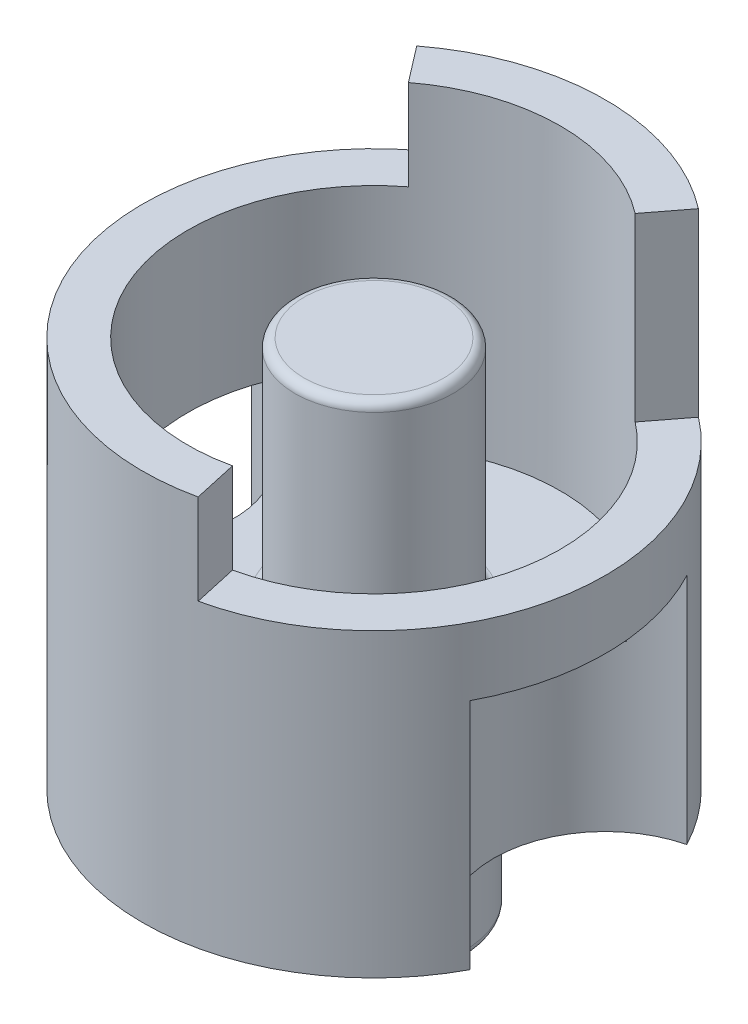
ISO-10303-21;
HEADER;
FILE_DESCRIPTION(('STEP AP214'),'2;1');
FILE_NAME('part.step','',(''),(''),'','','');
FILE_SCHEMA(('AUTOMOTIVE_DESIGN { 1 0 10303 214 1 1 1 1 }'));
ENDSEC;
DATA;
#1=APPLICATION_CONTEXT('core data for automotive mechanical design processes');
#2=APPLICATION_PROTOCOL_DEFINITION('international standard','automotive_design',2000,#1);
#3=PRODUCT_CONTEXT('',#1,'mechanical');
#4=PRODUCT('Part','Part','',(#3));
#5=PRODUCT_RELATED_PRODUCT_CATEGORY('part','',(#4));
#6=PRODUCT_DEFINITION_FORMATION('','',#4);
#7=PRODUCT_DEFINITION_CONTEXT('part definition',#1,'design');
#8=PRODUCT_DEFINITION('design','',#6,#7);
#9=PRODUCT_DEFINITION_SHAPE('','',#8);
#10=(LENGTH_UNIT() NAMED_UNIT(*) SI_UNIT(.MILLI.,.METRE.));
#11=(NAMED_UNIT(*) PLANE_ANGLE_UNIT() SI_UNIT($,.RADIAN.));
#12=(NAMED_UNIT(*) SI_UNIT($,.STERADIAN.) SOLID_ANGLE_UNIT());
#13=UNCERTAINTY_MEASURE_WITH_UNIT(LENGTH_MEASURE(1.E-05),#10,'distance_accuracy_value','');
#14=(GEOMETRIC_REPRESENTATION_CONTEXT(3) GLOBAL_UNCERTAINTY_ASSIGNED_CONTEXT((#13)) GLOBAL_UNIT_ASSIGNED_CONTEXT((#10,
#11,#12)) REPRESENTATION_CONTEXT('',''));
#15=CARTESIAN_POINT('',(0.,0.,0.));
#16=DIRECTION('',(0.,0.,1.));
#17=DIRECTION('',(1.,0.,0.));
#18=AXIS2_PLACEMENT_3D('',#15,#16,#17);
#19=CARTESIAN_POINT('',(0.,13.5382,0.));
#20=DIRECTION('',(0.,-1.,0.));
#21=DIRECTION('',(0.,0.,-1.));
#22=AXIS2_PLACEMENT_3D('',#19,#20,#21);
#23=CYLINDRICAL_SURFACE('',#22,6.50875);
#24=CARTESIAN_POINT('',(0.,0.,0.));
#25=DIRECTION('',(0.,1.,0.));
#26=DIRECTION('',(0.,0.,1.));
#27=AXIS2_PLACEMENT_3D('',#24,#25,#26);
#28=CIRCLE('',#27,6.50875);
#29=CARTESIAN_POINT('',(5.75095840382279,0.,-3.048));
#30=VERTEX_POINT('',#29);
#31=CARTESIAN_POINT('',(-5.99268108299615,0.,-2.54));
#32=VERTEX_POINT('',#31);
#33=EDGE_CURVE('E177',#30,#32,#28,.T.);
#34=ORIENTED_EDGE('',*,*,#33,.T.);
#35=DIRECTION('',(0.,-1.,0.));
#36=VECTOR('',#35,1.);
#37=CARTESIAN_POINT('',(-5.99268108299615,15.3157336749619,-2.54));
#38=LINE('',#37,#36);
#39=CARTESIAN_POINT('',(-5.99268108299615,6.5532,-2.54));
#40=VERTEX_POINT('',#39);
#41=EDGE_CURVE('E69',#40,#32,#38,.T.);
#42=ORIENTED_EDGE('',*,*,#41,.F.);
#43=CARTESIAN_POINT('',(0.,6.5532,0.));
#44=DIRECTION('',(0.,-1.,0.));
#45=DIRECTION('',(0.,0.,-1.));
#46=AXIS2_PLACEMENT_3D('',#43,#44,#45);
#47=CIRCLE('',#46,6.50875);
#48=CARTESIAN_POINT('',(-5.99268108299616,6.5532,2.54));
#49=VERTEX_POINT('',#48);
#50=EDGE_CURVE('E171',#40,#49,#47,.F.);
#51=ORIENTED_EDGE('',*,*,#50,.T.);
#52=DIRECTION('',(0.,-1.,0.));
#53=VECTOR('',#52,1.);
#54=CARTESIAN_POINT('',(-5.99268108299616,15.3157336749619,2.54));
#55=LINE('',#54,#53);
#56=CARTESIAN_POINT('',(-5.99268108299616,0.,2.54));
#57=VERTEX_POINT('',#56);
#58=EDGE_CURVE('E156',#49,#57,#55,.T.);
#59=ORIENTED_EDGE('',*,*,#58,.T.);
#60=CARTESIAN_POINT('',(5.75095840382279,0.,3.048));
#61=VERTEX_POINT('',#60);
#62=EDGE_CURVE('E169',#57,#61,#28,.T.);
#63=ORIENTED_EDGE('',*,*,#62,.T.);
#64=DIRECTION('',(0.,-1.,0.));
#65=VECTOR('',#64,1.);
#66=CARTESIAN_POINT('',(5.75095840382279,15.3157336749619,3.048));
#67=LINE('',#66,#65);
#68=CARTESIAN_POINT('',(5.75095840382279,6.5532,3.048));
#69=VERTEX_POINT('',#68);
#70=EDGE_CURVE('E77',#69,#61,#67,.T.);
#71=ORIENTED_EDGE('',*,*,#70,.F.);
#72=CARTESIAN_POINT('',(0.,6.5532,0.));
#73=DIRECTION('',(0.,-1.,0.));
#74=DIRECTION('',(0.,0.,-1.));
#75=AXIS2_PLACEMENT_3D('',#72,#73,#74);
#76=CIRCLE('',#75,6.50875);
#77=CARTESIAN_POINT('',(5.75095840382279,6.5532,-3.048));
#78=VERTEX_POINT('',#77);
#79=EDGE_CURVE('E408',#69,#78,#76,.F.);
#80=ORIENTED_EDGE('',*,*,#79,.T.);
#81=DIRECTION('',(0.,-1.,0.));
#82=VECTOR('',#81,1.);
#83=CARTESIAN_POINT('',(5.75095840382279,15.3157336749619,-3.048));
#84=LINE('',#83,#82);
#85=EDGE_CURVE('E404',#78,#30,#84,.T.);
#86=ORIENTED_EDGE('',*,*,#85,.T.);
#87=EDGE_LOOP('',(#34,#42,#51,#59,#63,#71,#80,#86));
#88=FACE_BOUND('',#87,.T.);
#89=CARTESIAN_POINT('',(0.,8.4582,0.));
#90=DIRECTION('',(0.,1.,0.));
#91=DIRECTION('',(0.,0.,-1.));
#92=AXIS2_PLACEMENT_3D('',#89,#90,#91);
#93=CIRCLE('',#92,6.50875);
#94=CARTESIAN_POINT('',(1.4087513372196,8.4582,6.35446663634187));
#95=VERTEX_POINT('',#94);
#96=CARTESIAN_POINT('',(3.96227595106051,8.4582,-5.16373855362057));
#97=VERTEX_POINT('',#96);
#98=EDGE_CURVE('E310',#95,#97,#93,.T.);
#99=ORIENTED_EDGE('',*,*,#98,.F.);
#100=DIRECTION('',(0.,1.,0.));
#101=VECTOR('',#100,1.);
#102=CARTESIAN_POINT('',(1.4087513372196,8.4582,6.35446663634187));
#103=LINE('',#102,#101);
#104=CARTESIAN_POINT('',(1.4087513372196,10.9982,6.35446663634187));
#105=VERTEX_POINT('',#104);
#106=EDGE_CURVE('E325',#95,#105,#103,.T.);
#107=ORIENTED_EDGE('',*,*,#106,.T.);
#108=CARTESIAN_POINT('',(0.,10.9982,0.));
#109=DIRECTION('',(0.,1.,0.));
#110=DIRECTION('',(0.,0.,1.));
#111=AXIS2_PLACEMENT_3D('',#108,#109,#110);
#112=CIRCLE('',#111,6.50875);
#113=CARTESIAN_POINT('',(-3.96227595106052,10.9982,-5.16373855362057));
#114=VERTEX_POINT('',#113);
#115=EDGE_CURVE('E306',#114,#105,#112,.T.);
#116=ORIENTED_EDGE('',*,*,#115,.F.);
#117=DIRECTION('',(0.,1.,0.));
#118=VECTOR('',#117,1.);
#119=CARTESIAN_POINT('',(-3.96227595106052,10.9982,-5.16373855362057));
#120=LINE('',#119,#118);
#121=CARTESIAN_POINT('',(-3.96227595106052,13.5382,-5.16373855362057));
#122=VERTEX_POINT('',#121);
#123=EDGE_CURVE('E178',#114,#122,#120,.T.);
#124=ORIENTED_EDGE('',*,*,#123,.T.);
#125=CARTESIAN_POINT('',(0.,13.5382,0.));
#126=DIRECTION('',(0.,1.,0.));
#127=DIRECTION('',(0.,0.,1.));
#128=AXIS2_PLACEMENT_3D('',#125,#126,#127);
#129=CIRCLE('',#128,6.50875);
#130=CARTESIAN_POINT('',(3.96227595106051,13.5382,-5.16373855362057));
#131=VERTEX_POINT('',#130);
#132=EDGE_CURVE('E182',#131,#122,#129,.T.);
#133=ORIENTED_EDGE('',*,*,#132,.F.);
#134=DIRECTION('',(0.,1.,0.));
#135=VECTOR('',#134,1.);
#136=CARTESIAN_POINT('',(3.96227595106052,10.9982,-5.16373855362057));
#137=LINE('',#136,#135);
#138=EDGE_CURVE('E338',#97,#131,#137,.T.);
#139=ORIENTED_EDGE('',*,*,#138,.F.);
#140=EDGE_LOOP('',(#99,#107,#116,#124,#133,#139));
#141=FACE_BOUND('',#140,.T.);
#142=ADVANCED_FACE('F53',(#88,#141),#23,.T.);
#143=CARTESIAN_POINT('',(0.,13.5382,0.));
#144=DIRECTION('',(0.,1.,0.));
#145=DIRECTION('',(0.,0.,1.));
#146=AXIS2_PLACEMENT_3D('',#143,#144,#145);
#147=PLANE('',#146);
#148=DIRECTION('',(-0.608761429008722,0.,-0.793353340291234));
#149=VECTOR('',#148,1.);
#150=CARTESIAN_POINT('',(-3.18914893621944,13.5382,-4.1561798114507));
#151=LINE('',#150,#149);
#152=CARTESIAN_POINT('',(-3.18914893621944,13.5382,-4.1561798114507));
#153=VERTEX_POINT('',#152);
#154=EDGE_CURVE('E335',#153,#122,#151,.T.);
#155=ORIENTED_EDGE('',*,*,#154,.F.);
#156=CARTESIAN_POINT('',(0.,13.5382,0.));
#157=DIRECTION('',(0.,1.,0.));
#158=DIRECTION('',(0.,0.,-1.));
#159=AXIS2_PLACEMENT_3D('',#156,#157,#158);
#160=CIRCLE('',#159,5.23875);
#161=CARTESIAN_POINT('',(3.18914893621944,13.5382,-4.1561798114507));
#162=VERTEX_POINT('',#161);
#163=EDGE_CURVE('E342',#162,#153,#160,.T.);
#164=ORIENTED_EDGE('',*,*,#163,.F.);
#165=DIRECTION('',(-0.608761429008721,0.,0.793353340291235));
#166=VECTOR('',#165,1.);
#167=CARTESIAN_POINT('',(3.18914893621944,13.5382,-4.1561798114507));
#168=LINE('',#167,#166);
#169=EDGE_CURVE('E328',#131,#162,#168,.T.);
#170=ORIENTED_EDGE('',*,*,#169,.F.);
#171=ORIENTED_EDGE('',*,*,#132,.T.);
#172=EDGE_LOOP('',(#155,#164,#170,#171));
#173=FACE_BOUND('',#172,.T.);
#174=ADVANCED_FACE('F247',(#173),#147,.T.);
#175=CARTESIAN_POINT('',(0.,0.,0.));
#176=DIRECTION('',(0.,1.,0.));
#177=DIRECTION('',(0.,0.,1.));
#178=AXIS2_PLACEMENT_3D('',#175,#176,#177);
#179=PLANE('',#178);
#180=CARTESIAN_POINT('',(0.,0.,0.));
#181=DIRECTION('',(0.,-1.,0.));
#182=DIRECTION('',(0.,0.,-1.));
#183=AXIS2_PLACEMENT_3D('',#180,#181,#182);
#184=CIRCLE('',#183,2.54);
#185=CARTESIAN_POINT('',(0.,0.,-2.54));
#186=VERTEX_POINT('',#185);
#187=EDGE_CURVE('E193',#186,#186,#184,.T.);
#188=ORIENTED_EDGE('',*,*,#187,.F.);
#189=EDGE_LOOP('',(#188));
#190=FACE_BOUND('',#189,.T.);
#191=ORIENTED_EDGE('',*,*,#62,.F.);
#192=CARTESIAN_POINT('',(-6.50875,0.,0.));
#193=DIRECTION('',(0.,-1.,0.));
#194=DIRECTION('',(0.,0.,1.));
#195=AXIS2_PLACEMENT_3D('',#192,#193,#194);
#196=CIRCLE('',#195,2.59189643448528);
#197=EDGE_CURVE('E152',#32,#57,#196,.T.);
#198=ORIENTED_EDGE('',*,*,#197,.F.);
#199=ORIENTED_EDGE('',*,*,#33,.F.);
#200=CARTESIAN_POINT('',(6.50875,0.,0.));
#201=DIRECTION('',(0.,-1.,0.));
#202=DIRECTION('',(0.,0.,-1.));
#203=AXIS2_PLACEMENT_3D('',#200,#201,#202);
#204=CIRCLE('',#203,3.14078845248081);
#205=EDGE_CURVE('E175',#61,#30,#204,.T.);
#206=ORIENTED_EDGE('',*,*,#205,.F.);
#207=EDGE_LOOP('',(#191,#198,#199,#206));
#208=FACE_BOUND('',#207,.T.);
#209=ADVANCED_FACE('F174',(#190,#208),#179,.F.);
#210=CARTESIAN_POINT('',(0.,-2.921,0.));
#211=DIRECTION('',(0.,1.,0.));
#212=DIRECTION('',(0.,0.,1.));
#213=AXIS2_PLACEMENT_3D('',#210,#211,#212);
#214=CYLINDRICAL_SURFACE('',#213,2.54);
#215=CARTESIAN_POINT('',(0.,-2.667,0.));
#216=DIRECTION('',(0.,-1.,0.));
#217=DIRECTION('',(0.,0.,-1.));
#218=AXIS2_PLACEMENT_3D('',#215,#216,#217);
#219=CIRCLE('',#218,2.54);
#220=CARTESIAN_POINT('',(0.,-2.667,-2.54));
#221=VERTEX_POINT('',#220);
#222=EDGE_CURVE('E62',#221,#221,#219,.F.);
#223=ORIENTED_EDGE('',*,*,#222,.T.);
#224=EDGE_LOOP('',(#223));
#225=FACE_BOUND('',#224,.T.);
#226=ORIENTED_EDGE('',*,*,#187,.T.);
#227=EDGE_LOOP('',(#226));
#228=FACE_BOUND('',#227,.T.);
#229=ADVANCED_FACE('F224',(#225,#228),#214,.T.);
#230=CARTESIAN_POINT('',(0.,-2.921,0.));
#231=DIRECTION('',(0.,-1.,0.));
#232=DIRECTION('',(0.,0.,-1.));
#233=AXIS2_PLACEMENT_3D('',#230,#231,#232);
#234=PLANE('',#233);
#235=CARTESIAN_POINT('',(0.,-2.921,0.));
#236=DIRECTION('',(0.,-1.,0.));
#237=DIRECTION('',(0.,0.,-1.));
#238=AXIS2_PLACEMENT_3D('',#235,#236,#237);
#239=CIRCLE('',#238,2.286);
#240=CARTESIAN_POINT('',(0.,-2.921,-2.286));
#241=VERTEX_POINT('',#240);
#242=EDGE_CURVE('E217',#241,#241,#239,.T.);
#243=ORIENTED_EDGE('',*,*,#242,.T.);
#244=EDGE_LOOP('',(#243));
#245=FACE_BOUND('',#244,.T.);
#246=ADVANCED_FACE('F233',(#245),#234,.T.);
#247=CARTESIAN_POINT('',(-3.18914893621944,10.9982,-4.1561798114507));
#248=DIRECTION('',(0.793353340291234,0.,-0.608761429008722));
#249=DIRECTION('',(-0.608761429008722,0.,-0.793353340291234));
#250=AXIS2_PLACEMENT_3D('',#247,#248,#249);
#251=PLANE('',#250);
#252=ORIENTED_EDGE('',*,*,#154,.T.);
#253=ORIENTED_EDGE('',*,*,#123,.F.);
#254=DIRECTION('',(-0.608761429008722,0.,-0.793353340291234));
#255=VECTOR('',#254,1.);
#256=CARTESIAN_POINT('',(-3.18914893621944,10.9982,-4.1561798114507));
#257=LINE('',#256,#255);
#258=CARTESIAN_POINT('',(-3.18914893621944,10.9982,-4.1561798114507));
#259=VERTEX_POINT('',#258);
#260=EDGE_CURVE('E334',#259,#114,#257,.T.);
#261=ORIENTED_EDGE('',*,*,#260,.F.);
#262=DIRECTION('',(0.,1.,0.));
#263=VECTOR('',#262,1.);
#264=CARTESIAN_POINT('',(-3.18914893621944,10.9982,-4.1561798114507));
#265=LINE('',#264,#263);
#266=EDGE_CURVE('E184',#259,#153,#265,.T.);
#267=ORIENTED_EDGE('',*,*,#266,.T.);
#268=EDGE_LOOP('',(#252,#253,#261,#267));
#269=FACE_BOUND('',#268,.T.);
#270=ADVANCED_FACE('F235',(#269),#251,.F.);
#271=CARTESIAN_POINT('',(0.,10.9982,0.));
#272=DIRECTION('',(0.,1.,0.));
#273=DIRECTION('',(0.,0.,1.));
#274=AXIS2_PLACEMENT_3D('',#271,#272,#273);
#275=CYLINDRICAL_SURFACE('',#274,5.23875);
#276=CARTESIAN_POINT('',(0.,4.6482,0.));
#277=DIRECTION('',(0.,1.,0.));
#278=DIRECTION('',(0.,0.,1.));
#279=AXIS2_PLACEMENT_3D('',#276,#277,#278);
#280=CIRCLE('',#279,5.23875);
#281=CARTESIAN_POINT('',(-4.84658352202055,4.6482,1.98875079549422));
#282=VERTEX_POINT('',#281);
#283=CARTESIAN_POINT('',(4.60486084284718,4.6482,2.49795079625535));
#284=VERTEX_POINT('',#283);
#285=EDGE_CURVE('E319',#282,#284,#280,.T.);
#286=ORIENTED_EDGE('',*,*,#285,.F.);
#287=DIRECTION('',(0.,-1.,0.));
#288=VECTOR('',#287,1.);
#289=CARTESIAN_POINT('',(-4.84658352202055,5.6007,1.98875079549422));
#290=LINE('',#289,#288);
#291=CARTESIAN_POINT('',(-4.84658352202055,6.5532,1.98875079549422));
#292=VERTEX_POINT('',#291);
#293=EDGE_CURVE('E377',#282,#292,#290,.F.);
#294=ORIENTED_EDGE('',*,*,#293,.T.);
#295=CARTESIAN_POINT('',(0.,6.5532,0.));
#296=DIRECTION('',(0.,-1.,0.));
#297=DIRECTION('',(0.,0.,-1.));
#298=AXIS2_PLACEMENT_3D('',#295,#296,#297);
#299=CIRCLE('',#298,5.23875);
#300=CARTESIAN_POINT('',(-4.84658352202055,6.5532,-1.98875079549422));
#301=VERTEX_POINT('',#300);
#302=EDGE_CURVE('E202',#301,#292,#299,.F.);
#303=ORIENTED_EDGE('',*,*,#302,.F.);
#304=DIRECTION('',(0.,-1.,0.));
#305=VECTOR('',#304,1.);
#306=CARTESIAN_POINT('',(-4.84658352202055,5.6007,-1.98875079549422));
#307=LINE('',#306,#305);
#308=CARTESIAN_POINT('',(-4.84658352202055,4.6482,-1.98875079549422));
#309=VERTEX_POINT('',#308);
#310=EDGE_CURVE('E383',#301,#309,#307,.T.);
#311=ORIENTED_EDGE('',*,*,#310,.T.);
#312=CARTESIAN_POINT('',(4.60486084284718,4.6482,-2.49795079625535));
#313=VERTEX_POINT('',#312);
#314=EDGE_CURVE('E311',#313,#309,#280,.T.);
#315=ORIENTED_EDGE('',*,*,#314,.F.);
#316=DIRECTION('',(0.,-1.,0.));
#317=VECTOR('',#316,1.);
#318=CARTESIAN_POINT('',(4.60486084284718,5.6007,-2.49795079625535));
#319=LINE('',#318,#317);
#320=CARTESIAN_POINT('',(4.60486084284718,6.5532,-2.49795079625535));
#321=VERTEX_POINT('',#320);
#322=EDGE_CURVE('E389',#313,#321,#319,.F.);
#323=ORIENTED_EDGE('',*,*,#322,.T.);
#324=CARTESIAN_POINT('',(0.,6.5532,0.));
#325=DIRECTION('',(0.,-1.,0.));
#326=DIRECTION('',(0.,0.,-1.));
#327=AXIS2_PLACEMENT_3D('',#324,#325,#326);
#328=CIRCLE('',#327,5.23875);
#329=CARTESIAN_POINT('',(4.60486084284718,6.5532,2.49795079625535));
#330=VERTEX_POINT('',#329);
#331=EDGE_CURVE('E199',#330,#321,#328,.F.);
#332=ORIENTED_EDGE('',*,*,#331,.F.);
#333=DIRECTION('',(0.,-1.,0.));
#334=VECTOR('',#333,1.);
#335=CARTESIAN_POINT('',(4.60486084284718,5.6007,2.49795079625535));
#336=LINE('',#335,#334);
#337=EDGE_CURVE('E393',#330,#284,#336,.T.);
#338=ORIENTED_EDGE('',*,*,#337,.T.);
#339=EDGE_LOOP('',(#286,#294,#303,#311,#315,#323,#332,#338));
#340=FACE_BOUND('',#339,.T.);
#341=ORIENTED_EDGE('',*,*,#163,.T.);
#342=ORIENTED_EDGE('',*,*,#266,.F.);
#343=CARTESIAN_POINT('',(0.,10.9982,0.));
#344=DIRECTION('',(0.,1.,0.));
#345=DIRECTION('',(0.,0.,1.));
#346=AXIS2_PLACEMENT_3D('',#343,#344,#345);
#347=CIRCLE('',#346,5.23875);
#348=CARTESIAN_POINT('',(1.13387302751821,10.9982,5.11457070729956));
#349=VERTEX_POINT('',#348);
#350=EDGE_CURVE('E189',#259,#349,#347,.T.);
#351=ORIENTED_EDGE('',*,*,#350,.T.);
#352=DIRECTION('',(0.,1.,0.));
#353=VECTOR('',#352,1.);
#354=CARTESIAN_POINT('',(1.13387302751821,8.4582,5.11457070729956));
#355=LINE('',#354,#353);
#356=CARTESIAN_POINT('',(1.13387302751821,8.4582,5.11457070729956));
#357=VERTEX_POINT('',#356);
#358=EDGE_CURVE('E329',#357,#349,#355,.T.);
#359=ORIENTED_EDGE('',*,*,#358,.F.);
#360=CARTESIAN_POINT('',(0.,8.4582,0.));
#361=DIRECTION('',(0.,1.,0.));
#362=DIRECTION('',(0.,0.,1.));
#363=AXIS2_PLACEMENT_3D('',#360,#361,#362);
#364=CIRCLE('',#363,5.23875);
#365=CARTESIAN_POINT('',(3.18914893621944,8.4582,-4.1561798114507));
#366=VERTEX_POINT('',#365);
#367=EDGE_CURVE('E369',#357,#366,#364,.T.);
#368=ORIENTED_EDGE('',*,*,#367,.T.);
#369=DIRECTION('',(0.,1.,0.));
#370=VECTOR('',#369,1.);
#371=CARTESIAN_POINT('',(3.18914893621944,10.9982,-4.1561798114507));
#372=LINE('',#371,#370);
#373=EDGE_CURVE('E350',#366,#162,#372,.T.);
#374=ORIENTED_EDGE('',*,*,#373,.T.);
#375=EDGE_LOOP('',(#341,#342,#351,#359,#368,#374));
#376=FACE_BOUND('',#375,.T.);
#377=ADVANCED_FACE('F241',(#340,#376),#275,.F.);
#378=CARTESIAN_POINT('',(3.18914893621944,10.9982,-4.1561798114507));
#379=DIRECTION('',(-0.793353340291235,0.,-0.608761429008721));
#380=DIRECTION('',(-0.608761429008721,0.,0.793353340291235));
#381=AXIS2_PLACEMENT_3D('',#378,#379,#380);
#382=PLANE('',#381);
#383=ORIENTED_EDGE('',*,*,#169,.T.);
#384=ORIENTED_EDGE('',*,*,#373,.F.);
#385=DIRECTION('',(-0.608761429008721,0.,0.793353340291235));
#386=VECTOR('',#385,1.);
#387=CARTESIAN_POINT('',(3.96227595106051,8.4582,-5.16373855362057));
#388=LINE('',#387,#386);
#389=EDGE_CURVE('E316',#97,#366,#388,.T.);
#390=ORIENTED_EDGE('',*,*,#389,.F.);
#391=ORIENTED_EDGE('',*,*,#138,.T.);
#392=EDGE_LOOP('',(#383,#384,#390,#391));
#393=FACE_BOUND('',#392,.T.);
#394=ADVANCED_FACE('F292',(#393),#382,.F.);
#395=CARTESIAN_POINT('',(0.,10.9982,0.));
#396=DIRECTION('',(0.,1.,0.));
#397=DIRECTION('',(0.,0.,1.));
#398=AXIS2_PLACEMENT_3D('',#395,#396,#397);
#399=PLANE('',#398);
#400=DIRECTION('',(0.216439613938098,0.,0.976296007119935));
#401=VECTOR('',#400,1.);
#402=CARTESIAN_POINT('',(1.4087513372196,10.9982,6.35446663634187));
#403=LINE('',#402,#401);
#404=EDGE_CURVE('E302',#349,#105,#403,.T.);
#405=ORIENTED_EDGE('',*,*,#404,.F.);
#406=ORIENTED_EDGE('',*,*,#350,.F.);
#407=ORIENTED_EDGE('',*,*,#260,.T.);
#408=ORIENTED_EDGE('',*,*,#115,.T.);
#409=EDGE_LOOP('',(#405,#406,#407,#408));
#410=FACE_BOUND('',#409,.T.);
#411=ADVANCED_FACE('F282',(#410),#399,.T.);
#412=CARTESIAN_POINT('',(1.4087513372196,8.4582,6.35446663634187));
#413=DIRECTION('',(-0.976296007119934,0.,0.216439613938098));
#414=DIRECTION('',(0.216439613938098,0.,0.976296007119935));
#415=AXIS2_PLACEMENT_3D('',#412,#413,#414);
#416=PLANE('',#415);
#417=ORIENTED_EDGE('',*,*,#404,.T.);
#418=ORIENTED_EDGE('',*,*,#106,.F.);
#419=DIRECTION('',(0.216439613938098,0.,0.976296007119935));
#420=VECTOR('',#419,1.);
#421=CARTESIAN_POINT('',(1.4087513372196,8.4582,6.35446663634187));
#422=LINE('',#421,#420);
#423=EDGE_CURVE('E323',#357,#95,#422,.T.);
#424=ORIENTED_EDGE('',*,*,#423,.F.);
#425=ORIENTED_EDGE('',*,*,#358,.T.);
#426=EDGE_LOOP('',(#417,#418,#424,#425));
#427=FACE_BOUND('',#426,.T.);
#428=ADVANCED_FACE('F291',(#427),#416,.F.);
#429=CARTESIAN_POINT('',(0.,8.4582,0.));
#430=DIRECTION('',(0.,-1.,0.));
#431=DIRECTION('',(0.,0.,-1.));
#432=AXIS2_PLACEMENT_3D('',#429,#430,#431);
#433=PLANE('',#432);
#434=ORIENTED_EDGE('',*,*,#389,.T.);
#435=ORIENTED_EDGE('',*,*,#367,.F.);
#436=ORIENTED_EDGE('',*,*,#423,.T.);
#437=ORIENTED_EDGE('',*,*,#98,.T.);
#438=EDGE_LOOP('',(#434,#435,#436,#437));
#439=FACE_BOUND('',#438,.T.);
#440=ADVANCED_FACE('F286',(#439),#433,.F.);
#441=CARTESIAN_POINT('',(0.,4.6482,0.));
#442=DIRECTION('',(0.,1.,0.));
#443=DIRECTION('',(0.,0.,1.));
#444=AXIS2_PLACEMENT_3D('',#441,#442,#443);
#445=PLANE('',#444);
#446=CARTESIAN_POINT('',(0.,4.6482,0.));
#447=DIRECTION('',(0.,1.,0.));
#448=DIRECTION('',(0.,0.,1.));
#449=AXIS2_PLACEMENT_3D('',#446,#447,#448);
#450=CIRCLE('',#449,2.4765);
#451=CARTESIAN_POINT('',(0.,4.6482,2.4765));
#452=VERTEX_POINT('',#451);
#453=EDGE_CURVE('E213',#452,#452,#450,.F.);
#454=ORIENTED_EDGE('',*,*,#453,.T.);
#455=EDGE_LOOP('',(#454));
#456=FACE_BOUND('',#455,.T.);
#457=CARTESIAN_POINT('',(-6.50875,4.6482,0.));
#458=DIRECTION('',(0.,1.,0.));
#459=DIRECTION('',(0.,0.,1.));
#460=AXIS2_PLACEMENT_3D('',#457,#458,#459);
#461=CIRCLE('',#460,2.59189643448528);
#462=EDGE_CURVE('E196',#282,#309,#461,.T.);
#463=ORIENTED_EDGE('',*,*,#462,.F.);
#464=ORIENTED_EDGE('',*,*,#285,.T.);
#465=CARTESIAN_POINT('',(6.50875,4.6482,0.));
#466=DIRECTION('',(0.,1.,0.));
#467=DIRECTION('',(0.,0.,1.));
#468=AXIS2_PLACEMENT_3D('',#465,#466,#467);
#469=CIRCLE('',#468,3.14078845248081);
#470=EDGE_CURVE('E192',#313,#284,#469,.T.);
#471=ORIENTED_EDGE('',*,*,#470,.F.);
#472=ORIENTED_EDGE('',*,*,#314,.T.);
#473=EDGE_LOOP('',(#463,#464,#471,#472));
#474=FACE_BOUND('',#473,.T.);
#475=ADVANCED_FACE('F280',(#456,#474),#445,.T.);
#476=CARTESIAN_POINT('',(0.,10.9982,0.));
#477=DIRECTION('',(0.,1.,0.));
#478=DIRECTION('',(0.,0.,1.));
#479=AXIS2_PLACEMENT_3D('',#476,#477,#478);
#480=CIRCLE('',#479,1.9685);
#481=CARTESIAN_POINT('',(0.,10.9982,1.9685));
#482=VERTEX_POINT('',#481);
#483=EDGE_CURVE('E14',#482,#482,#480,.T.);
#484=ORIENTED_EDGE('',*,*,#483,.T.);
#485=EDGE_LOOP('',(#484));
#486=FACE_BOUND('',#485,.T.);
#487=ADVANCED_FACE('F271',(#486),#399,.T.);
#488=CARTESIAN_POINT('',(0.,8.4582,0.));
#489=DIRECTION('',(0.,1.,0.));
#490=DIRECTION('',(0.,0.,1.));
#491=AXIS2_PLACEMENT_3D('',#488,#489,#490);
#492=CYLINDRICAL_SURFACE('',#491,2.2225);
#493=CARTESIAN_POINT('',(0.,4.9022,0.));
#494=DIRECTION('',(0.,1.,0.));
#495=DIRECTION('',(0.,0.,1.));
#496=AXIS2_PLACEMENT_3D('',#493,#494,#495);
#497=CIRCLE('',#496,2.2225);
#498=CARTESIAN_POINT('',(0.,4.9022,2.2225));
#499=VERTEX_POINT('',#498);
#500=EDGE_CURVE('E209',#499,#499,#497,.T.);
#501=ORIENTED_EDGE('',*,*,#500,.T.);
#502=EDGE_LOOP('',(#501));
#503=FACE_BOUND('',#502,.T.);
#504=CARTESIAN_POINT('',(0.,10.7442,0.));
#505=DIRECTION('',(0.,1.,0.));
#506=DIRECTION('',(0.,0.,1.));
#507=AXIS2_PLACEMENT_3D('',#504,#505,#506);
#508=CIRCLE('',#507,2.2225);
#509=CARTESIAN_POINT('',(0.,10.7442,2.2225));
#510=VERTEX_POINT('',#509);
#511=EDGE_CURVE('E205',#510,#510,#508,.F.);
#512=ORIENTED_EDGE('',*,*,#511,.T.);
#513=EDGE_LOOP('',(#512));
#514=FACE_BOUND('',#513,.T.);
#515=ADVANCED_FACE('F267',(#503,#514),#492,.T.);
#516=CARTESIAN_POINT('',(0.,6.5532,0.));
#517=DIRECTION('',(0.,-1.,0.));
#518=DIRECTION('',(0.,0.,-1.));
#519=AXIS2_PLACEMENT_3D('',#516,#517,#518);
#520=PLANE('',#519);
#521=ORIENTED_EDGE('',*,*,#331,.T.);
#522=CARTESIAN_POINT('',(6.50875,6.5532,0.));
#523=DIRECTION('',(0.,-1.,0.));
#524=DIRECTION('',(0.,0.,-1.));
#525=AXIS2_PLACEMENT_3D('',#522,#523,#524);
#526=CIRCLE('',#525,3.14078845248081);
#527=EDGE_CURVE('E163',#78,#321,#526,.F.);
#528=ORIENTED_EDGE('',*,*,#527,.F.);
#529=ORIENTED_EDGE('',*,*,#79,.F.);
#530=EDGE_CURVE('E401',#330,#69,#526,.F.);
#531=ORIENTED_EDGE('',*,*,#530,.F.);
#532=EDGE_LOOP('',(#521,#528,#529,#531));
#533=FACE_BOUND('',#532,.T.);
#534=ADVANCED_FACE('F270',(#533),#520,.T.);
#535=CARTESIAN_POINT('',(6.50875,15.3157336749619,0.));
#536=DIRECTION('',(0.,-1.,0.));
#537=DIRECTION('',(0.,0.,-1.));
#538=AXIS2_PLACEMENT_3D('',#535,#536,#537);
#539=CYLINDRICAL_SURFACE('',#538,3.14078845248081);
#540=ORIENTED_EDGE('',*,*,#470,.T.);
#541=ORIENTED_EDGE('',*,*,#337,.F.);
#542=ORIENTED_EDGE('',*,*,#530,.T.);
#543=ORIENTED_EDGE('',*,*,#70,.T.);
#544=ORIENTED_EDGE('',*,*,#205,.T.);
#545=ORIENTED_EDGE('',*,*,#85,.F.);
#546=ORIENTED_EDGE('',*,*,#527,.T.);
#547=ORIENTED_EDGE('',*,*,#322,.F.);
#548=EDGE_LOOP('',(#540,#541,#542,#543,#544,#545,#546,#547));
#549=FACE_BOUND('',#548,.T.);
#550=ADVANCED_FACE('F426',(#549),#539,.F.);
#551=CARTESIAN_POINT('',(0.,6.5532,0.));
#552=DIRECTION('',(0.,-1.,0.));
#553=DIRECTION('',(0.,0.,-1.));
#554=AXIS2_PLACEMENT_3D('',#551,#552,#553);
#555=PLANE('',#554);
#556=ORIENTED_EDGE('',*,*,#302,.T.);
#557=CARTESIAN_POINT('',(-6.50875,6.5532,0.));
#558=DIRECTION('',(0.,-1.,0.));
#559=DIRECTION('',(0.,0.,-1.));
#560=AXIS2_PLACEMENT_3D('',#557,#558,#559);
#561=CIRCLE('',#560,2.59189643448528);
#562=EDGE_CURVE('E397',#49,#292,#561,.F.);
#563=ORIENTED_EDGE('',*,*,#562,.F.);
#564=ORIENTED_EDGE('',*,*,#50,.F.);
#565=EDGE_CURVE('E416',#301,#40,#561,.F.);
#566=ORIENTED_EDGE('',*,*,#565,.F.);
#567=EDGE_LOOP('',(#556,#563,#564,#566));
#568=FACE_BOUND('',#567,.T.);
#569=ADVANCED_FACE('F261',(#568),#555,.T.);
#570=CARTESIAN_POINT('',(-6.50875,15.3157336749619,0.));
#571=DIRECTION('',(0.,-1.,0.));
#572=DIRECTION('',(0.,0.,-1.));
#573=AXIS2_PLACEMENT_3D('',#570,#571,#572);
#574=CYLINDRICAL_SURFACE('',#573,2.59189643448528);
#575=ORIENTED_EDGE('',*,*,#462,.T.);
#576=ORIENTED_EDGE('',*,*,#310,.F.);
#577=ORIENTED_EDGE('',*,*,#565,.T.);
#578=ORIENTED_EDGE('',*,*,#41,.T.);
#579=ORIENTED_EDGE('',*,*,#197,.T.);
#580=ORIENTED_EDGE('',*,*,#58,.F.);
#581=ORIENTED_EDGE('',*,*,#562,.T.);
#582=ORIENTED_EDGE('',*,*,#293,.F.);
#583=EDGE_LOOP('',(#575,#576,#577,#578,#579,#580,#581,#582));
#584=FACE_BOUND('',#583,.T.);
#585=ADVANCED_FACE('F154',(#584),#574,.F.);
#586=CARTESIAN_POINT('',(0.,4.9022,0.));
#587=DIRECTION('',(0.,1.,0.));
#588=DIRECTION('',(0.,0.,1.));
#589=AXIS2_PLACEMENT_3D('',#586,#587,#588);
#590=TOROIDAL_SURFACE('',#589,2.4765,0.254);
#591=ORIENTED_EDGE('',*,*,#453,.F.);
#592=EDGE_LOOP('',(#591));
#593=FACE_BOUND('',#592,.T.);
#594=ORIENTED_EDGE('',*,*,#500,.F.);
#595=EDGE_LOOP('',(#594));
#596=FACE_BOUND('',#595,.T.);
#597=ADVANCED_FACE('F230',(#593,#596),#590,.F.);
#598=CARTESIAN_POINT('',(0.,-2.667,0.));
#599=DIRECTION('',(0.,-1.,0.));
#600=DIRECTION('',(0.,0.,-1.));
#601=AXIS2_PLACEMENT_3D('',#598,#599,#600);
#602=TOROIDAL_SURFACE('',#601,2.286,0.254);
#603=ORIENTED_EDGE('',*,*,#222,.F.);
#604=EDGE_LOOP('',(#603));
#605=FACE_BOUND('',#604,.T.);
#606=ORIENTED_EDGE('',*,*,#242,.F.);
#607=EDGE_LOOP('',(#606));
#608=FACE_BOUND('',#607,.T.);
#609=ADVANCED_FACE('F227',(#605,#608),#602,.T.);
#610=CARTESIAN_POINT('',(0.,10.7442,0.));
#611=DIRECTION('',(0.,1.,0.));
#612=DIRECTION('',(0.,0.,1.));
#613=AXIS2_PLACEMENT_3D('',#610,#611,#612);
#614=TOROIDAL_SURFACE('',#613,1.9685,0.254);
#615=ORIENTED_EDGE('',*,*,#511,.F.);
#616=EDGE_LOOP('',(#615));
#617=FACE_BOUND('',#616,.T.);
#618=ORIENTED_EDGE('',*,*,#483,.F.);
#619=EDGE_LOOP('',(#618));
#620=FACE_BOUND('',#619,.T.);
#621=ADVANCED_FACE('F55',(#617,#620),#614,.T.);
#622=CLOSED_SHELL('',(#142,#174,#209,#229,#246,#270,#377,#394,#411,#428,#440,#475,#487,#515,
#534,#550,#569,#585,#597,#609,#621));
#623=MANIFOLD_SOLID_BREP('B2',#622);
#624=ADVANCED_BREP_SHAPE_REPRESENTATION('',(#18,#623),#14);
#625=SHAPE_DEFINITION_REPRESENTATION(#9,#624);
ENDSEC;
END-ISO-10303-21;
